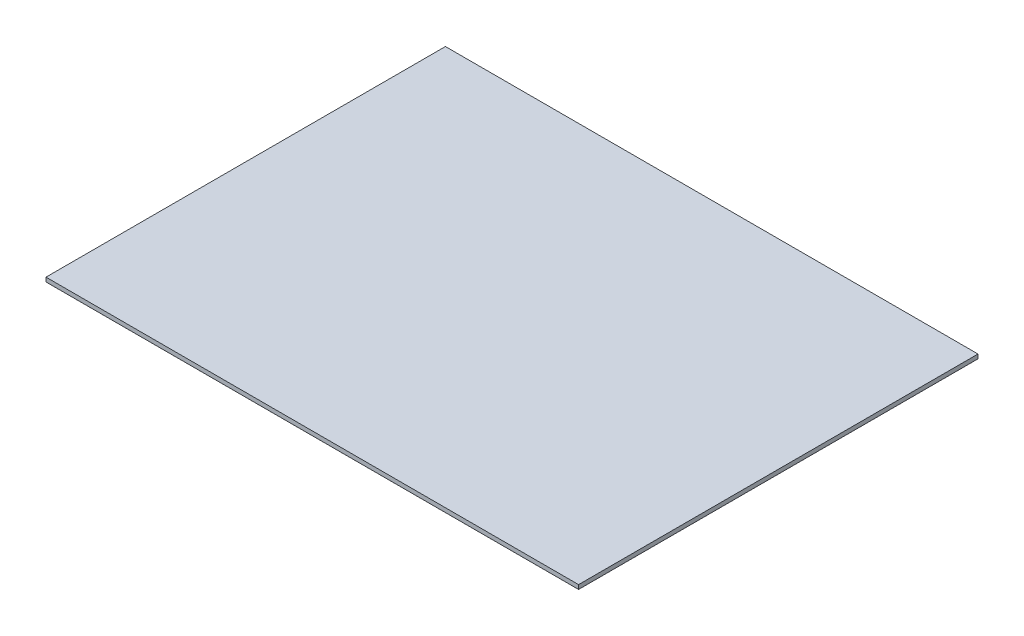
ISO-10303-21;
HEADER;
FILE_DESCRIPTION(('STEP AP214'),'2;1');
FILE_NAME('part.step','',(''),(''),'','','');
FILE_SCHEMA(('AUTOMOTIVE_DESIGN { 1 0 10303 214 1 1 1 1 }'));
ENDSEC;
DATA;
#1=APPLICATION_CONTEXT('core data for automotive mechanical design processes');
#2=APPLICATION_PROTOCOL_DEFINITION('international standard','automotive_design',2000,#1);
#3=PRODUCT_CONTEXT('',#1,'mechanical');
#4=PRODUCT('Part','Part','',(#3));
#5=PRODUCT_RELATED_PRODUCT_CATEGORY('part','',(#4));
#6=PRODUCT_DEFINITION_FORMATION('','',#4);
#7=PRODUCT_DEFINITION_CONTEXT('part definition',#1,'design');
#8=PRODUCT_DEFINITION('design','',#6,#7);
#9=PRODUCT_DEFINITION_SHAPE('','',#8);
#10=(LENGTH_UNIT() NAMED_UNIT(*) SI_UNIT(.MILLI.,.METRE.));
#11=(NAMED_UNIT(*) PLANE_ANGLE_UNIT() SI_UNIT($,.RADIAN.));
#12=(NAMED_UNIT(*) SI_UNIT($,.STERADIAN.) SOLID_ANGLE_UNIT());
#13=UNCERTAINTY_MEASURE_WITH_UNIT(LENGTH_MEASURE(1.E-05),#10,'distance_accuracy_value','');
#14=(GEOMETRIC_REPRESENTATION_CONTEXT(3) GLOBAL_UNCERTAINTY_ASSIGNED_CONTEXT((#13)) GLOBAL_UNIT_ASSIGNED_CONTEXT((#10,
#11,#12)) REPRESENTATION_CONTEXT('',''));
#15=CARTESIAN_POINT('',(0.,0.,0.));
#16=DIRECTION('',(0.,0.,1.));
#17=DIRECTION('',(1.,0.,0.));
#18=AXIS2_PLACEMENT_3D('',#15,#16,#17);
#19=CARTESIAN_POINT('',(-50.8,-0.017399,-38.1));
#20=DIRECTION('',(0.,0.,1.));
#21=DIRECTION('',(1.,0.,0.));
#22=AXIS2_PLACEMENT_3D('',#19,#20,#21);
#23=PLANE('',#22);
#24=DIRECTION('',(1.,0.,0.));
#25=VECTOR('',#24,1.);
#26=CARTESIAN_POINT('',(-50.8,0.,-38.1));
#27=LINE('',#26,#25);
#28=CARTESIAN_POINT('',(-50.8,0.,-38.1));
#29=VERTEX_POINT('',#28);
#30=CARTESIAN_POINT('',(50.8,0.,-38.1));
#31=VERTEX_POINT('',#30);
#32=EDGE_CURVE('E106',#29,#31,#27,.T.);
#33=ORIENTED_EDGE('',*,*,#32,.T.);
#34=DIRECTION('',(0.,1.,0.));
#35=VECTOR('',#34,1.);
#36=CARTESIAN_POINT('',(50.8,-0.017399,-38.1));
#37=LINE('',#36,#35);
#38=CARTESIAN_POINT('',(50.8,-0.017399,-38.1));
#39=VERTEX_POINT('',#38);
#40=EDGE_CURVE('E12',#39,#31,#37,.T.);
#41=ORIENTED_EDGE('',*,*,#40,.F.);
#42=DIRECTION('',(1.,0.,0.));
#43=VECTOR('',#42,1.);
#44=CARTESIAN_POINT('',(-50.8,-0.017399,-38.1));
#45=LINE('',#44,#43);
#46=CARTESIAN_POINT('',(-50.8,-0.017399,-38.1));
#47=VERTEX_POINT('',#46);
#48=EDGE_CURVE('E94',#47,#39,#45,.T.);
#49=ORIENTED_EDGE('',*,*,#48,.F.);
#50=DIRECTION('',(0.,1.,0.));
#51=VECTOR('',#50,1.);
#52=CARTESIAN_POINT('',(-50.8,-0.017399,-38.1));
#53=LINE('',#52,#51);
#54=EDGE_CURVE('E102',#47,#29,#53,.T.);
#55=ORIENTED_EDGE('',*,*,#54,.T.);
#56=EDGE_LOOP('',(#33,#41,#49,#55));
#57=FACE_BOUND('',#56,.T.);
#58=ADVANCED_FACE('F43',(#57),#23,.F.);
#59=CARTESIAN_POINT('',(50.8,-0.017399,-38.1));
#60=DIRECTION('',(-1.,0.,0.));
#61=DIRECTION('',(0.,0.,1.));
#62=AXIS2_PLACEMENT_3D('',#59,#60,#61);
#63=PLANE('',#62);
#64=DIRECTION('',(0.,0.,1.));
#65=VECTOR('',#64,1.);
#66=CARTESIAN_POINT('',(50.8,0.,-38.1));
#67=LINE('',#66,#65);
#68=CARTESIAN_POINT('',(50.8,0.,38.1));
#69=VERTEX_POINT('',#68);
#70=EDGE_CURVE('E98',#31,#69,#67,.T.);
#71=ORIENTED_EDGE('',*,*,#70,.T.);
#72=DIRECTION('',(0.,1.,0.));
#73=VECTOR('',#72,1.);
#74=CARTESIAN_POINT('',(50.8,-0.017399,38.1));
#75=LINE('',#74,#73);
#76=CARTESIAN_POINT('',(50.8,-0.017399,38.1));
#77=VERTEX_POINT('',#76);
#78=EDGE_CURVE('E51',#77,#69,#75,.T.);
#79=ORIENTED_EDGE('',*,*,#78,.F.);
#80=DIRECTION('',(0.,0.,1.));
#81=VECTOR('',#80,1.);
#82=CARTESIAN_POINT('',(50.8,-0.017399,-38.1));
#83=LINE('',#82,#81);
#84=EDGE_CURVE('E89',#39,#77,#83,.T.);
#85=ORIENTED_EDGE('',*,*,#84,.F.);
#86=ORIENTED_EDGE('',*,*,#40,.T.);
#87=EDGE_LOOP('',(#71,#79,#85,#86));
#88=FACE_BOUND('',#87,.T.);
#89=ADVANCED_FACE('F97',(#88),#63,.F.);
#90=CARTESIAN_POINT('',(50.8,-0.017399,38.1));
#91=DIRECTION('',(0.,0.,-1.));
#92=DIRECTION('',(-1.,0.,0.));
#93=AXIS2_PLACEMENT_3D('',#90,#91,#92);
#94=PLANE('',#93);
#95=DIRECTION('',(-1.,0.,0.));
#96=VECTOR('',#95,1.);
#97=CARTESIAN_POINT('',(50.8,0.,38.1));
#98=LINE('',#97,#96);
#99=CARTESIAN_POINT('',(-50.8,0.,38.1));
#100=VERTEX_POINT('',#99);
#101=EDGE_CURVE('E76',#69,#100,#98,.T.);
#102=ORIENTED_EDGE('',*,*,#101,.T.);
#103=DIRECTION('',(0.,1.,0.));
#104=VECTOR('',#103,1.);
#105=CARTESIAN_POINT('',(-50.8,-0.017399,38.1));
#106=LINE('',#105,#104);
#107=CARTESIAN_POINT('',(-50.8,-0.017399,38.1));
#108=VERTEX_POINT('',#107);
#109=EDGE_CURVE('E99',#108,#100,#106,.T.);
#110=ORIENTED_EDGE('',*,*,#109,.F.);
#111=DIRECTION('',(-1.,0.,0.));
#112=VECTOR('',#111,1.);
#113=CARTESIAN_POINT('',(50.8,-0.017399,38.1));
#114=LINE('',#113,#112);
#115=EDGE_CURVE('E92',#77,#108,#114,.T.);
#116=ORIENTED_EDGE('',*,*,#115,.F.);
#117=ORIENTED_EDGE('',*,*,#78,.T.);
#118=EDGE_LOOP('',(#102,#110,#116,#117));
#119=FACE_BOUND('',#118,.T.);
#120=ADVANCED_FACE('F100',(#119),#94,.F.);
#121=CARTESIAN_POINT('',(-50.8,-0.017399,38.1));
#122=DIRECTION('',(1.,0.,0.));
#123=DIRECTION('',(0.,0.,-1.));
#124=AXIS2_PLACEMENT_3D('',#121,#122,#123);
#125=PLANE('',#124);
#126=DIRECTION('',(0.,0.,-1.));
#127=VECTOR('',#126,1.);
#128=CARTESIAN_POINT('',(-50.8,0.,38.1));
#129=LINE('',#128,#127);
#130=EDGE_CURVE('E82',#100,#29,#129,.T.);
#131=ORIENTED_EDGE('',*,*,#130,.T.);
#132=ORIENTED_EDGE('',*,*,#54,.F.);
#133=DIRECTION('',(0.,0.,-1.));
#134=VECTOR('',#133,1.);
#135=CARTESIAN_POINT('',(-50.8,-0.017399,38.1));
#136=LINE('',#135,#134);
#137=EDGE_CURVE('E59',#108,#47,#136,.T.);
#138=ORIENTED_EDGE('',*,*,#137,.F.);
#139=ORIENTED_EDGE('',*,*,#109,.T.);
#140=EDGE_LOOP('',(#131,#132,#138,#139));
#141=FACE_BOUND('',#140,.T.);
#142=ADVANCED_FACE('F113',(#141),#125,.F.);
#143=CARTESIAN_POINT('',(0.,-0.017399,0.));
#144=DIRECTION('',(0.,-1.,0.));
#145=DIRECTION('',(0.,0.,-1.));
#146=AXIS2_PLACEMENT_3D('',#143,#144,#145);
#147=PLANE('',#146);
#148=ORIENTED_EDGE('',*,*,#48,.T.);
#149=ORIENTED_EDGE('',*,*,#84,.T.);
#150=ORIENTED_EDGE('',*,*,#115,.T.);
#151=ORIENTED_EDGE('',*,*,#137,.T.);
#152=EDGE_LOOP('',(#148,#149,#150,#151));
#153=FACE_BOUND('',#152,.T.);
#154=ADVANCED_FACE('F90',(#153),#147,.T.);
#155=CARTESIAN_POINT('',(0.,0.,0.));
#156=DIRECTION('',(0.,-1.,0.));
#157=DIRECTION('',(0.,0.,-1.));
#158=AXIS2_PLACEMENT_3D('',#155,#156,#157);
#159=PLANE('',#158);
#160=ORIENTED_EDGE('',*,*,#32,.F.);
#161=ORIENTED_EDGE('',*,*,#130,.F.);
#162=ORIENTED_EDGE('',*,*,#101,.F.);
#163=ORIENTED_EDGE('',*,*,#70,.F.);
#164=EDGE_LOOP('',(#160,#161,#162,#163));
#165=FACE_BOUND('',#164,.T.);
#166=ADVANCED_FACE('F116',(#165),#159,.F.);
#167=CLOSED_SHELL('',(#58,#89,#120,#142,#154,#166));
#168=MANIFOLD_SOLID_BREP('B2',#167);
#169=CARTESIAN_POINT('',(50.8,0.7874,38.1));
#170=DIRECTION('',(-1.,0.,0.));
#171=DIRECTION('',(0.,0.,1.));
#172=AXIS2_PLACEMENT_3D('',#169,#170,#171);
#173=PLANE('',#172);
#174=DIRECTION('',(0.,0.,-1.));
#175=VECTOR('',#174,1.);
#176=CARTESIAN_POINT('',(50.8,0.,38.1));
#177=LINE('',#176,#175);
#178=CARTESIAN_POINT('',(50.8,0.,38.1));
#179=VERTEX_POINT('',#178);
#180=CARTESIAN_POINT('',(50.8,0.,-38.1));
#181=VERTEX_POINT('',#180);
#182=EDGE_CURVE('E230',#179,#181,#177,.T.);
#183=ORIENTED_EDGE('',*,*,#182,.T.);
#184=DIRECTION('',(0.,-1.,0.));
#185=VECTOR('',#184,1.);
#186=CARTESIAN_POINT('',(50.8,0.7874,-38.1));
#187=LINE('',#186,#185);
#188=CARTESIAN_POINT('',(50.8,0.7874,-38.1));
#189=VERTEX_POINT('',#188);
#190=EDGE_CURVE('E41',#189,#181,#187,.T.);
#191=ORIENTED_EDGE('',*,*,#190,.F.);
#192=DIRECTION('',(0.,0.,-1.));
#193=VECTOR('',#192,1.);
#194=CARTESIAN_POINT('',(50.8,0.7874,38.1));
#195=LINE('',#194,#193);
#196=CARTESIAN_POINT('',(50.8,0.7874,38.1));
#197=VERTEX_POINT('',#196);
#198=EDGE_CURVE('E218',#197,#189,#195,.T.);
#199=ORIENTED_EDGE('',*,*,#198,.F.);
#200=DIRECTION('',(0.,-1.,0.));
#201=VECTOR('',#200,1.);
#202=CARTESIAN_POINT('',(50.8,0.7874,38.1));
#203=LINE('',#202,#201);
#204=EDGE_CURVE('E226',#197,#179,#203,.T.);
#205=ORIENTED_EDGE('',*,*,#204,.T.);
#206=EDGE_LOOP('',(#183,#191,#199,#205));
#207=FACE_BOUND('',#206,.T.);
#208=ADVANCED_FACE('F167',(#207),#173,.F.);
#209=CARTESIAN_POINT('',(-50.8,0.7874,-38.1));
#210=DIRECTION('',(0.,0.,1.));
#211=DIRECTION('',(1.,0.,0.));
#212=AXIS2_PLACEMENT_3D('',#209,#210,#211);
#213=PLANE('',#212);
#214=DIRECTION('',(-1.,0.,0.));
#215=VECTOR('',#214,1.);
#216=CARTESIAN_POINT('',(-50.8,0.,-38.1));
#217=LINE('',#216,#215);
#218=CARTESIAN_POINT('',(-50.8,0.,-38.1));
#219=VERTEX_POINT('',#218);
#220=EDGE_CURVE('E222',#181,#219,#217,.T.);
#221=ORIENTED_EDGE('',*,*,#220,.T.);
#222=DIRECTION('',(0.,-1.,0.));
#223=VECTOR('',#222,1.);
#224=CARTESIAN_POINT('',(-50.8,0.7874,-38.1));
#225=LINE('',#224,#223);
#226=CARTESIAN_POINT('',(-50.8,0.7874,-38.1));
#227=VERTEX_POINT('',#226);
#228=EDGE_CURVE('E175',#227,#219,#225,.T.);
#229=ORIENTED_EDGE('',*,*,#228,.F.);
#230=DIRECTION('',(-1.,0.,0.));
#231=VECTOR('',#230,1.);
#232=CARTESIAN_POINT('',(-50.8,0.7874,-38.1));
#233=LINE('',#232,#231);
#234=EDGE_CURVE('E213',#189,#227,#233,.T.);
#235=ORIENTED_EDGE('',*,*,#234,.F.);
#236=ORIENTED_EDGE('',*,*,#190,.T.);
#237=EDGE_LOOP('',(#221,#229,#235,#236));
#238=FACE_BOUND('',#237,.T.);
#239=ADVANCED_FACE('F221',(#238),#213,.F.);
#240=CARTESIAN_POINT('',(-50.8,0.7874,38.1));
#241=DIRECTION('',(1.,0.,0.));
#242=DIRECTION('',(0.,0.,-1.));
#243=AXIS2_PLACEMENT_3D('',#240,#241,#242);
#244=PLANE('',#243);
#245=DIRECTION('',(0.,0.,1.));
#246=VECTOR('',#245,1.);
#247=CARTESIAN_POINT('',(-50.8,0.,38.1));
#248=LINE('',#247,#246);
#249=CARTESIAN_POINT('',(-50.8,0.,38.1));
#250=VERTEX_POINT('',#249);
#251=EDGE_CURVE('E200',#219,#250,#248,.T.);
#252=ORIENTED_EDGE('',*,*,#251,.T.);
#253=DIRECTION('',(0.,-1.,0.));
#254=VECTOR('',#253,1.);
#255=CARTESIAN_POINT('',(-50.8,0.7874,38.1));
#256=LINE('',#255,#254);
#257=CARTESIAN_POINT('',(-50.8,0.7874,38.1));
#258=VERTEX_POINT('',#257);
#259=EDGE_CURVE('E223',#258,#250,#256,.T.);
#260=ORIENTED_EDGE('',*,*,#259,.F.);
#261=DIRECTION('',(0.,0.,1.));
#262=VECTOR('',#261,1.);
#263=CARTESIAN_POINT('',(-50.8,0.7874,38.1));
#264=LINE('',#263,#262);
#265=EDGE_CURVE('E216',#227,#258,#264,.T.);
#266=ORIENTED_EDGE('',*,*,#265,.F.);
#267=ORIENTED_EDGE('',*,*,#228,.T.);
#268=EDGE_LOOP('',(#252,#260,#266,#267));
#269=FACE_BOUND('',#268,.T.);
#270=ADVANCED_FACE('F224',(#269),#244,.F.);
#271=CARTESIAN_POINT('',(-50.8,0.7874,38.1));
#272=DIRECTION('',(0.,0.,-1.));
#273=DIRECTION('',(-1.,0.,0.));
#274=AXIS2_PLACEMENT_3D('',#271,#272,#273);
#275=PLANE('',#274);
#276=DIRECTION('',(1.,0.,0.));
#277=VECTOR('',#276,1.);
#278=CARTESIAN_POINT('',(-50.8,0.,38.1));
#279=LINE('',#278,#277);
#280=EDGE_CURVE('E206',#250,#179,#279,.T.);
#281=ORIENTED_EDGE('',*,*,#280,.T.);
#282=ORIENTED_EDGE('',*,*,#204,.F.);
#283=DIRECTION('',(1.,0.,0.));
#284=VECTOR('',#283,1.);
#285=CARTESIAN_POINT('',(-50.8,0.7874,38.1));
#286=LINE('',#285,#284);
#287=EDGE_CURVE('E183',#258,#197,#286,.T.);
#288=ORIENTED_EDGE('',*,*,#287,.F.);
#289=ORIENTED_EDGE('',*,*,#259,.T.);
#290=EDGE_LOOP('',(#281,#282,#288,#289));
#291=FACE_BOUND('',#290,.T.);
#292=ADVANCED_FACE('F237',(#291),#275,.F.);
#293=CARTESIAN_POINT('',(0.,0.7874,0.));
#294=DIRECTION('',(0.,-1.,0.));
#295=DIRECTION('',(0.,0.,-1.));
#296=AXIS2_PLACEMENT_3D('',#293,#294,#295);
#297=PLANE('',#296);
#298=ORIENTED_EDGE('',*,*,#198,.T.);
#299=ORIENTED_EDGE('',*,*,#234,.T.);
#300=ORIENTED_EDGE('',*,*,#265,.T.);
#301=ORIENTED_EDGE('',*,*,#287,.T.);
#302=EDGE_LOOP('',(#298,#299,#300,#301));
#303=FACE_BOUND('',#302,.T.);
#304=ADVANCED_FACE('F214',(#303),#297,.F.);
#305=CARTESIAN_POINT('',(0.,0.,0.));
#306=DIRECTION('',(0.,-1.,0.));
#307=DIRECTION('',(0.,0.,-1.));
#308=AXIS2_PLACEMENT_3D('',#305,#306,#307);
#309=PLANE('',#308);
#310=ORIENTED_EDGE('',*,*,#182,.F.);
#311=ORIENTED_EDGE('',*,*,#280,.F.);
#312=ORIENTED_EDGE('',*,*,#251,.F.);
#313=ORIENTED_EDGE('',*,*,#220,.F.);
#314=EDGE_LOOP('',(#310,#311,#312,#313));
#315=FACE_BOUND('',#314,.T.);
#316=ADVANCED_FACE('F240',(#315),#309,.T.);
#317=CLOSED_SHELL('',(#208,#239,#270,#292,#304,#316));
#318=MANIFOLD_SOLID_BREP('B6',#317);
#319=ADVANCED_BREP_SHAPE_REPRESENTATION('',(#18,#168,#318),#14);
#320=SHAPE_DEFINITION_REPRESENTATION(#9,#319);
ENDSEC;
END-ISO-10303-21;
